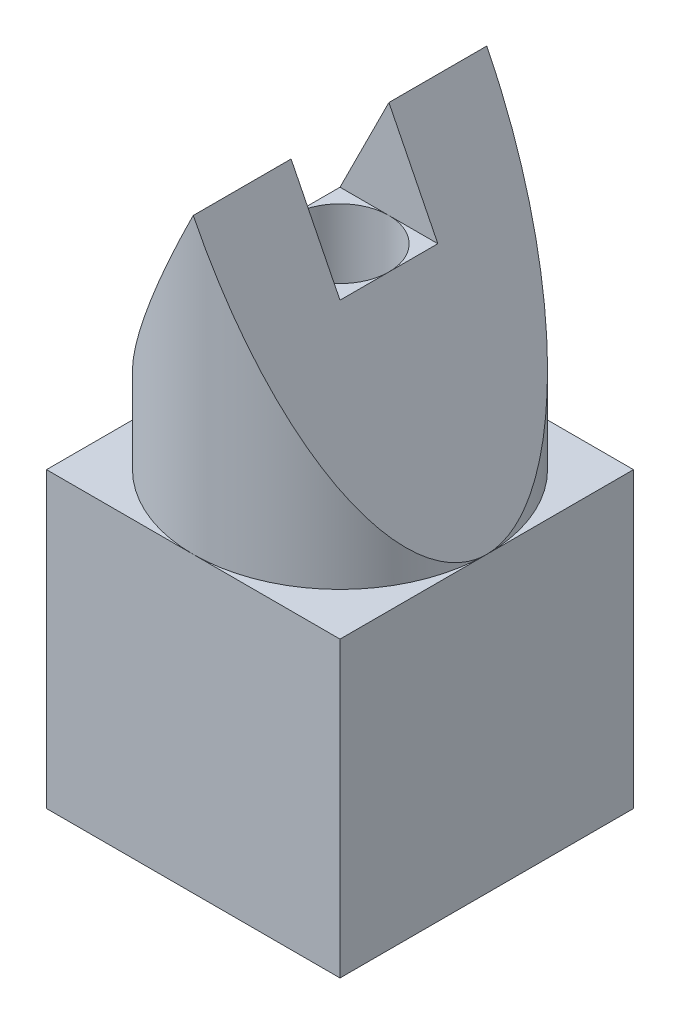
ISO-10303-21;
HEADER;
FILE_DESCRIPTION(('STEP AP214'),'2;1');
FILE_NAME('part.step','',(''),(''),'','','');
FILE_SCHEMA(('AUTOMOTIVE_DESIGN { 1 0 10303 214 1 1 1 1 }'));
ENDSEC;
DATA;
#1=APPLICATION_CONTEXT('core data for automotive mechanical design processes');
#2=APPLICATION_PROTOCOL_DEFINITION('international standard','automotive_design',2000,#1);
#3=PRODUCT_CONTEXT('',#1,'mechanical');
#4=PRODUCT('Part','Part','',(#3));
#5=PRODUCT_RELATED_PRODUCT_CATEGORY('part','',(#4));
#6=PRODUCT_DEFINITION_FORMATION('','',#4);
#7=PRODUCT_DEFINITION_CONTEXT('part definition',#1,'design');
#8=PRODUCT_DEFINITION('design','',#6,#7);
#9=PRODUCT_DEFINITION_SHAPE('','',#8);
#10=(LENGTH_UNIT() NAMED_UNIT(*) SI_UNIT(.MILLI.,.METRE.));
#11=(NAMED_UNIT(*) PLANE_ANGLE_UNIT() SI_UNIT($,.RADIAN.));
#12=(NAMED_UNIT(*) SI_UNIT($,.STERADIAN.) SOLID_ANGLE_UNIT());
#13=UNCERTAINTY_MEASURE_WITH_UNIT(LENGTH_MEASURE(1.E-05),#10,'distance_accuracy_value','');
#14=(GEOMETRIC_REPRESENTATION_CONTEXT(3) GLOBAL_UNCERTAINTY_ASSIGNED_CONTEXT((#13)) GLOBAL_UNIT_ASSIGNED_CONTEXT((#10,
#11,#12)) REPRESENTATION_CONTEXT('',''));
#15=CARTESIAN_POINT('',(0.,0.,0.));
#16=DIRECTION('',(0.,0.,1.));
#17=DIRECTION('',(1.,0.,0.));
#18=AXIS2_PLACEMENT_3D('',#15,#16,#17);
#19=CARTESIAN_POINT('',(0.,120.,0.));
#20=DIRECTION('',(0.,-1.,0.));
#21=DIRECTION('',(0.,0.,-1.));
#22=AXIS2_PLACEMENT_3D('',#19,#20,#21);
#23=CYLINDRICAL_SURFACE('',#22,30.);
#24=CARTESIAN_POINT('',(0.,120.,0.));
#25=DIRECTION('',(-0.894427190999916,0.447213595499958,0.));
#26=DIRECTION('',(-0.447213595499958,-0.894427190999916,0.));
#27=AXIS2_PLACEMENT_3D('',#24,#25,#26);
#28=ELLIPSE('',#27,67.0820393249937,30.);
#29=CARTESIAN_POINT('',(-30.,60.,0.));
#30=VERTEX_POINT('',#29);
#31=CARTESIAN_POINT('',(0.,120.,30.));
#32=VERTEX_POINT('',#31);
#33=EDGE_CURVE('E197',#30,#32,#28,.T.);
#34=ORIENTED_EDGE('',*,*,#33,.F.);
#35=CARTESIAN_POINT('',(0.,60.,0.));
#36=DIRECTION('',(0.,1.,0.));
#37=DIRECTION('',(0.,0.,1.));
#38=AXIS2_PLACEMENT_3D('',#35,#36,#37);
#39=CIRCLE('',#38,30.);
#40=CARTESIAN_POINT('',(0.,60.,30.));
#41=VERTEX_POINT('',#40);
#42=EDGE_CURVE('E165',#41,#30,#39,.F.);
#43=ORIENTED_EDGE('',*,*,#42,.F.);
#44=CARTESIAN_POINT('',(30.,60.,0.));
#45=VERTEX_POINT('',#44);
#46=EDGE_CURVE('E136',#45,#41,#39,.F.);
#47=ORIENTED_EDGE('',*,*,#46,.F.);
#48=CARTESIAN_POINT('',(0.,120.,0.));
#49=DIRECTION('',(0.894427190999916,0.447213595499958,0.));
#50=DIRECTION('',(0.447213595499958,-0.894427190999916,0.));
#51=AXIS2_PLACEMENT_3D('',#48,#49,#50);
#52=ELLIPSE('',#51,67.0820393249937,30.);
#53=EDGE_CURVE('E64',#32,#45,#52,.T.);
#54=ORIENTED_EDGE('',*,*,#53,.F.);
#55=EDGE_LOOP('',(#34,#43,#47,#54));
#56=FACE_BOUND('',#55,.T.);
#57=ADVANCED_FACE('F39',(#56),#23,.T.);
#58=CARTESIAN_POINT('',(0.,120.,-30.));
#59=VERTEX_POINT('',#58);
#60=EDGE_CURVE('E56',#59,#30,#28,.T.);
#61=ORIENTED_EDGE('',*,*,#60,.F.);
#62=EDGE_CURVE('E168',#45,#59,#52,.T.);
#63=ORIENTED_EDGE('',*,*,#62,.F.);
#64=CARTESIAN_POINT('',(0.,60.,-30.));
#65=VERTEX_POINT('',#64);
#66=EDGE_CURVE('E157',#65,#45,#39,.F.);
#67=ORIENTED_EDGE('',*,*,#66,.F.);
#68=EDGE_CURVE('E162',#30,#65,#39,.F.);
#69=ORIENTED_EDGE('',*,*,#68,.F.);
#70=EDGE_LOOP('',(#61,#63,#67,#69));
#71=FACE_BOUND('',#70,.T.);
#72=ADVANCED_FACE('F169',(#71),#23,.T.);
#73=CARTESIAN_POINT('',(0.,100.,10.));
#74=DIRECTION('',(0.,0.,-1.));
#75=DIRECTION('',(-1.,0.,0.));
#76=AXIS2_PLACEMENT_3D('',#73,#74,#75);
#77=PLANE('',#76);
#78=DIRECTION('',(-1.,0.,0.));
#79=VECTOR('',#78,1.);
#80=CARTESIAN_POINT('',(0.,100.,10.));
#81=LINE('',#80,#79);
#82=CARTESIAN_POINT('',(0.,100.,10.));
#83=VERTEX_POINT('',#82);
#84=CARTESIAN_POINT('',(-10.,100.,10.));
#85=VERTEX_POINT('',#84);
#86=EDGE_CURVE('E202',#83,#85,#81,.T.);
#87=ORIENTED_EDGE('',*,*,#86,.T.);
#88=DIRECTION('',(0.447213595499958,0.894427190999916,0.));
#89=VECTOR('',#88,1.);
#90=CARTESIAN_POINT('',(-8.,104.,10.));
#91=LINE('',#90,#89);
#92=CARTESIAN_POINT('',(0.,120.,10.));
#93=VERTEX_POINT('',#92);
#94=EDGE_CURVE('E192',#85,#93,#91,.T.);
#95=ORIENTED_EDGE('',*,*,#94,.T.);
#96=DIRECTION('',(0.447213595499958,-0.894427190999916,0.));
#97=VECTOR('',#96,1.);
#98=CARTESIAN_POINT('',(7.99999999999999,104.,10.));
#99=LINE('',#98,#97);
#100=CARTESIAN_POINT('',(9.99999999999999,100.,10.));
#101=VERTEX_POINT('',#100);
#102=EDGE_CURVE('E182',#93,#101,#99,.T.);
#103=ORIENTED_EDGE('',*,*,#102,.T.);
#104=EDGE_CURVE('E203',#101,#83,#81,.T.);
#105=ORIENTED_EDGE('',*,*,#104,.T.);
#106=EDGE_LOOP('',(#87,#95,#103,#105));
#107=FACE_BOUND('',#106,.T.);
#108=ADVANCED_FACE('F336',(#107),#77,.T.);
#109=CARTESIAN_POINT('',(0.,100.,-9.99999999999999));
#110=DIRECTION('',(0.,0.,-1.));
#111=DIRECTION('',(-1.,0.,0.));
#112=AXIS2_PLACEMENT_3D('',#109,#110,#111);
#113=PLANE('',#112);
#114=DIRECTION('',(0.447213595499958,0.894427190999916,0.));
#115=VECTOR('',#114,1.);
#116=CARTESIAN_POINT('',(-8.,104.,-9.99999999999999));
#117=LINE('',#116,#115);
#118=CARTESIAN_POINT('',(-10.,100.,-9.99999999999999));
#119=VERTEX_POINT('',#118);
#120=CARTESIAN_POINT('',(0.,120.,-9.99999999999999));
#121=VERTEX_POINT('',#120);
#122=EDGE_CURVE('E174',#119,#121,#117,.T.);
#123=ORIENTED_EDGE('',*,*,#122,.F.);
#124=DIRECTION('',(-1.,0.,0.));
#125=VECTOR('',#124,1.);
#126=CARTESIAN_POINT('',(0.,100.,-9.99999999999999));
#127=LINE('',#126,#125);
#128=CARTESIAN_POINT('',(0.,100.,-9.99999999999999));
#129=VERTEX_POINT('',#128);
#130=EDGE_CURVE('E212',#129,#119,#127,.T.);
#131=ORIENTED_EDGE('',*,*,#130,.F.);
#132=CARTESIAN_POINT('',(10.,100.,-9.99999999999999));
#133=VERTEX_POINT('',#132);
#134=EDGE_CURVE('E213',#133,#129,#127,.T.);
#135=ORIENTED_EDGE('',*,*,#134,.F.);
#136=DIRECTION('',(0.447213595499958,-0.894427190999916,0.));
#137=VECTOR('',#136,1.);
#138=CARTESIAN_POINT('',(7.99999999999999,104.,-9.99999999999999));
#139=LINE('',#138,#137);
#140=EDGE_CURVE('E185',#121,#133,#139,.T.);
#141=ORIENTED_EDGE('',*,*,#140,.F.);
#142=EDGE_LOOP('',(#123,#131,#135,#141));
#143=FACE_BOUND('',#142,.T.);
#144=ADVANCED_FACE('F274',(#143),#113,.F.);
#145=CARTESIAN_POINT('',(0.,100.,0.));
#146=DIRECTION('',(0.,1.,0.));
#147=DIRECTION('',(0.,0.,1.));
#148=AXIS2_PLACEMENT_3D('',#145,#146,#147);
#149=PLANE('',#148);
#150=ORIENTED_EDGE('',*,*,#86,.F.);
#151=CARTESIAN_POINT('',(0.,100.,0.));
#152=DIRECTION('',(0.,1.,0.));
#153=DIRECTION('',(0.,0.,1.));
#154=AXIS2_PLACEMENT_3D('',#151,#152,#153);
#155=CIRCLE('',#154,10.);
#156=CARTESIAN_POINT('',(-10.,100.,0.));
#157=VERTEX_POINT('',#156);
#158=EDGE_CURVE('E11',#83,#157,#155,.F.);
#159=ORIENTED_EDGE('',*,*,#158,.T.);
#160=DIRECTION('',(0.,0.,1.));
#161=VECTOR('',#160,1.);
#162=CARTESIAN_POINT('',(-10.,100.,0.));
#163=LINE('',#162,#161);
#164=EDGE_CURVE('E207',#157,#85,#163,.T.);
#165=ORIENTED_EDGE('',*,*,#164,.T.);
#166=EDGE_LOOP('',(#150,#159,#165));
#167=FACE_BOUND('',#166,.T.);
#168=ADVANCED_FACE('F328',(#167),#149,.T.);
#169=EDGE_CURVE('E208',#119,#157,#163,.T.);
#170=ORIENTED_EDGE('',*,*,#169,.T.);
#171=EDGE_CURVE('E49',#157,#129,#155,.F.);
#172=ORIENTED_EDGE('',*,*,#171,.T.);
#173=ORIENTED_EDGE('',*,*,#130,.T.);
#174=EDGE_LOOP('',(#170,#172,#173));
#175=FACE_BOUND('',#174,.T.);
#176=ADVANCED_FACE('F268',(#175),#149,.T.);
#177=ORIENTED_EDGE('',*,*,#134,.T.);
#178=CARTESIAN_POINT('',(10.,100.,0.));
#179=VERTEX_POINT('',#178);
#180=EDGE_CURVE('E256',#129,#179,#155,.F.);
#181=ORIENTED_EDGE('',*,*,#180,.T.);
#182=DIRECTION('',(0.,0.,1.));
#183=VECTOR('',#182,1.);
#184=CARTESIAN_POINT('',(10.,100.,0.));
#185=LINE('',#184,#183);
#186=EDGE_CURVE('E167',#133,#179,#185,.T.);
#187=ORIENTED_EDGE('',*,*,#186,.F.);
#188=EDGE_LOOP('',(#177,#181,#187));
#189=FACE_BOUND('',#188,.T.);
#190=ADVANCED_FACE('F277',(#189),#149,.T.);
#191=CARTESIAN_POINT('',(0.,60.,0.));
#192=DIRECTION('',(0.,1.,0.));
#193=DIRECTION('',(0.,0.,1.));
#194=AXIS2_PLACEMENT_3D('',#191,#192,#193);
#195=PLANE('',#194);
#196=DIRECTION('',(1.,0.,0.));
#197=VECTOR('',#196,1.);
#198=CARTESIAN_POINT('',(-30.,60.,30.));
#199=LINE('',#198,#197);
#200=CARTESIAN_POINT('',(-30.,60.,30.));
#201=VERTEX_POINT('',#200);
#202=EDGE_CURVE('E156',#201,#41,#199,.T.);
#203=ORIENTED_EDGE('',*,*,#202,.T.);
#204=ORIENTED_EDGE('',*,*,#42,.T.);
#205=DIRECTION('',(0.,0.,-1.));
#206=VECTOR('',#205,1.);
#207=CARTESIAN_POINT('',(-30.,60.,30.));
#208=LINE('',#207,#206);
#209=EDGE_CURVE('E228',#201,#30,#208,.T.);
#210=ORIENTED_EDGE('',*,*,#209,.F.);
#211=EDGE_LOOP('',(#203,#204,#210));
#212=FACE_BOUND('',#211,.T.);
#213=ADVANCED_FACE('F298',(#212),#195,.T.);
#214=CARTESIAN_POINT('',(-30.,60.,-30.));
#215=VERTEX_POINT('',#214);
#216=EDGE_CURVE('E227',#30,#215,#208,.T.);
#217=ORIENTED_EDGE('',*,*,#216,.F.);
#218=ORIENTED_EDGE('',*,*,#68,.T.);
#219=DIRECTION('',(1.,0.,0.));
#220=VECTOR('',#219,1.);
#221=CARTESIAN_POINT('',(-30.,60.,-30.));
#222=LINE('',#221,#220);
#223=EDGE_CURVE('E224',#215,#65,#222,.T.);
#224=ORIENTED_EDGE('',*,*,#223,.F.);
#225=EDGE_LOOP('',(#217,#218,#224));
#226=FACE_BOUND('',#225,.T.);
#227=ADVANCED_FACE('F301',(#226),#195,.T.);
#228=CARTESIAN_POINT('',(30.,60.,-30.));
#229=VERTEX_POINT('',#228);
#230=EDGE_CURVE('E143',#65,#229,#222,.T.);
#231=ORIENTED_EDGE('',*,*,#230,.F.);
#232=ORIENTED_EDGE('',*,*,#66,.T.);
#233=DIRECTION('',(0.,0.,-1.));
#234=VECTOR('',#233,1.);
#235=CARTESIAN_POINT('',(30.,60.,30.));
#236=LINE('',#235,#234);
#237=EDGE_CURVE('E144',#45,#229,#236,.T.);
#238=ORIENTED_EDGE('',*,*,#237,.T.);
#239=EDGE_LOOP('',(#231,#232,#238));
#240=FACE_BOUND('',#239,.T.);
#241=ADVANCED_FACE('F158',(#240),#195,.T.);
#242=CARTESIAN_POINT('',(-30.,60.,30.));
#243=DIRECTION('',(0.,0.,-1.));
#244=DIRECTION('',(-1.,0.,0.));
#245=AXIS2_PLACEMENT_3D('',#242,#243,#244);
#246=PLANE('',#245);
#247=DIRECTION('',(1.,0.,0.));
#248=VECTOR('',#247,1.);
#249=CARTESIAN_POINT('',(-30.,0.,30.));
#250=LINE('',#249,#248);
#251=CARTESIAN_POINT('',(-30.,0.,30.));
#252=VERTEX_POINT('',#251);
#253=CARTESIAN_POINT('',(30.,0.,30.));
#254=VERTEX_POINT('',#253);
#255=EDGE_CURVE('E233',#252,#254,#250,.T.);
#256=ORIENTED_EDGE('',*,*,#255,.T.);
#257=DIRECTION('',(0.,-1.,0.));
#258=VECTOR('',#257,1.);
#259=CARTESIAN_POINT('',(30.,60.,30.));
#260=LINE('',#259,#258);
#261=CARTESIAN_POINT('',(30.,60.,30.));
#262=VERTEX_POINT('',#261);
#263=EDGE_CURVE('E252',#262,#254,#260,.T.);
#264=ORIENTED_EDGE('',*,*,#263,.F.);
#265=EDGE_CURVE('E138',#41,#262,#199,.T.);
#266=ORIENTED_EDGE('',*,*,#265,.F.);
#267=ORIENTED_EDGE('',*,*,#202,.F.);
#268=DIRECTION('',(0.,-1.,0.));
#269=VECTOR('',#268,1.);
#270=CARTESIAN_POINT('',(-30.,60.,30.));
#271=LINE('',#270,#269);
#272=EDGE_CURVE('E232',#201,#252,#271,.T.);
#273=ORIENTED_EDGE('',*,*,#272,.T.);
#274=EDGE_LOOP('',(#256,#264,#266,#267,#273));
#275=FACE_BOUND('',#274,.T.);
#276=ADVANCED_FACE('F41',(#275),#246,.F.);
#277=CARTESIAN_POINT('',(30.,60.,30.));
#278=DIRECTION('',(-1.,0.,0.));
#279=DIRECTION('',(0.,0.,1.));
#280=AXIS2_PLACEMENT_3D('',#277,#278,#279);
#281=PLANE('',#280);
#282=DIRECTION('',(0.,0.,-1.));
#283=VECTOR('',#282,1.);
#284=CARTESIAN_POINT('',(30.,0.,30.));
#285=LINE('',#284,#283);
#286=CARTESIAN_POINT('',(30.,0.,-30.));
#287=VERTEX_POINT('',#286);
#288=EDGE_CURVE('E236',#254,#287,#285,.T.);
#289=ORIENTED_EDGE('',*,*,#288,.T.);
#290=DIRECTION('',(0.,-1.,0.));
#291=VECTOR('',#290,1.);
#292=CARTESIAN_POINT('',(30.,60.,-30.));
#293=LINE('',#292,#291);
#294=EDGE_CURVE('E152',#229,#287,#293,.T.);
#295=ORIENTED_EDGE('',*,*,#294,.F.);
#296=ORIENTED_EDGE('',*,*,#237,.F.);
#297=EDGE_CURVE('E133',#262,#45,#236,.T.);
#298=ORIENTED_EDGE('',*,*,#297,.F.);
#299=ORIENTED_EDGE('',*,*,#263,.T.);
#300=EDGE_LOOP('',(#289,#295,#296,#298,#299));
#301=FACE_BOUND('',#300,.T.);
#302=ADVANCED_FACE('F150',(#301),#281,.F.);
#303=CARTESIAN_POINT('',(-30.,60.,-30.));
#304=DIRECTION('',(0.,0.,-1.));
#305=DIRECTION('',(-1.,0.,0.));
#306=AXIS2_PLACEMENT_3D('',#303,#304,#305);
#307=PLANE('',#306);
#308=ORIENTED_EDGE('',*,*,#223,.T.);
#309=ORIENTED_EDGE('',*,*,#230,.T.);
#310=ORIENTED_EDGE('',*,*,#294,.T.);
#311=DIRECTION('',(1.,0.,0.));
#312=VECTOR('',#311,1.);
#313=CARTESIAN_POINT('',(-30.,0.,-30.));
#314=LINE('',#313,#312);
#315=CARTESIAN_POINT('',(-30.,0.,-30.));
#316=VERTEX_POINT('',#315);
#317=EDGE_CURVE('E239',#316,#287,#314,.T.);
#318=ORIENTED_EDGE('',*,*,#317,.F.);
#319=DIRECTION('',(0.,-1.,0.));
#320=VECTOR('',#319,1.);
#321=CARTESIAN_POINT('',(-30.,60.,-30.));
#322=LINE('',#321,#320);
#323=EDGE_CURVE('E247',#215,#316,#322,.T.);
#324=ORIENTED_EDGE('',*,*,#323,.F.);
#325=EDGE_LOOP('',(#308,#309,#310,#318,#324));
#326=FACE_BOUND('',#325,.T.);
#327=ADVANCED_FACE('F313',(#326),#307,.T.);
#328=CARTESIAN_POINT('',(-30.,60.,30.));
#329=DIRECTION('',(-1.,0.,0.));
#330=DIRECTION('',(0.,0.,1.));
#331=AXIS2_PLACEMENT_3D('',#328,#329,#330);
#332=PLANE('',#331);
#333=ORIENTED_EDGE('',*,*,#209,.T.);
#334=ORIENTED_EDGE('',*,*,#216,.T.);
#335=ORIENTED_EDGE('',*,*,#323,.T.);
#336=DIRECTION('',(0.,0.,-1.));
#337=VECTOR('',#336,1.);
#338=CARTESIAN_POINT('',(-30.,0.,30.));
#339=LINE('',#338,#337);
#340=EDGE_CURVE('E242',#252,#316,#339,.T.);
#341=ORIENTED_EDGE('',*,*,#340,.F.);
#342=ORIENTED_EDGE('',*,*,#272,.F.);
#343=EDGE_LOOP('',(#333,#334,#335,#341,#342));
#344=FACE_BOUND('',#343,.T.);
#345=ADVANCED_FACE('F305',(#344),#332,.T.);
#346=ORIENTED_EDGE('',*,*,#297,.T.);
#347=ORIENTED_EDGE('',*,*,#46,.T.);
#348=ORIENTED_EDGE('',*,*,#265,.T.);
#349=EDGE_LOOP('',(#346,#347,#348));
#350=FACE_BOUND('',#349,.T.);
#351=ADVANCED_FACE('F135',(#350),#195,.T.);
#352=CARTESIAN_POINT('',(0.,0.,0.));
#353=DIRECTION('',(0.,1.,0.));
#354=DIRECTION('',(0.,0.,1.));
#355=AXIS2_PLACEMENT_3D('',#352,#353,#354);
#356=PLANE('',#355);
#357=CARTESIAN_POINT('',(0.,0.,0.));
#358=DIRECTION('',(0.,1.,0.));
#359=DIRECTION('',(0.,0.,1.));
#360=AXIS2_PLACEMENT_3D('',#357,#358,#359);
#361=CIRCLE('',#360,10.);
#362=CARTESIAN_POINT('',(0.,0.,10.));
#363=VERTEX_POINT('',#362);
#364=EDGE_CURVE('E198',#363,#363,#361,.T.);
#365=ORIENTED_EDGE('',*,*,#364,.T.);
#366=EDGE_LOOP('',(#365));
#367=FACE_BOUND('',#366,.T.);
#368=ORIENTED_EDGE('',*,*,#288,.F.);
#369=ORIENTED_EDGE('',*,*,#255,.F.);
#370=ORIENTED_EDGE('',*,*,#340,.T.);
#371=ORIENTED_EDGE('',*,*,#317,.T.);
#372=EDGE_LOOP('',(#368,#369,#370,#371));
#373=FACE_BOUND('',#372,.T.);
#374=ADVANCED_FACE('F317',(#367,#373),#356,.F.);
#375=EDGE_CURVE('E217',#179,#101,#185,.T.);
#376=ORIENTED_EDGE('',*,*,#375,.F.);
#377=EDGE_CURVE('E43',#179,#83,#155,.F.);
#378=ORIENTED_EDGE('',*,*,#377,.T.);
#379=ORIENTED_EDGE('',*,*,#104,.F.);
#380=EDGE_LOOP('',(#376,#378,#379));
#381=FACE_BOUND('',#380,.T.);
#382=ADVANCED_FACE('F319',(#381),#149,.T.);
#383=CARTESIAN_POINT('',(0.,120.,0.));
#384=DIRECTION('',(0.,-1.,0.));
#385=DIRECTION('',(0.,0.,-1.));
#386=AXIS2_PLACEMENT_3D('',#383,#384,#385);
#387=CYLINDRICAL_SURFACE('',#386,10.);
#388=ORIENTED_EDGE('',*,*,#377,.F.);
#389=ORIENTED_EDGE('',*,*,#180,.F.);
#390=ORIENTED_EDGE('',*,*,#171,.F.);
#391=ORIENTED_EDGE('',*,*,#158,.F.);
#392=EDGE_LOOP('',(#388,#389,#390,#391));
#393=FACE_BOUND('',#392,.T.);
#394=ORIENTED_EDGE('',*,*,#364,.F.);
#395=EDGE_LOOP('',(#394));
#396=FACE_BOUND('',#395,.T.);
#397=ADVANCED_FACE('F326',(#393,#396),#387,.F.);
#398=CARTESIAN_POINT('',(-30.,60.,238.711730708738));
#399=DIRECTION('',(-0.894427190999916,0.447213595499958,0.));
#400=DIRECTION('',(-0.447213595499958,-0.894427190999916,0.));
#401=AXIS2_PLACEMENT_3D('',#398,#399,#400);
#402=PLANE('',#401);
#403=ORIENTED_EDGE('',*,*,#60,.T.);
#404=ORIENTED_EDGE('',*,*,#33,.T.);
#405=DIRECTION('',(0.,0.,-1.));
#406=VECTOR('',#405,1.);
#407=CARTESIAN_POINT('',(0.,120.,238.711730708738));
#408=LINE('',#407,#406);
#409=EDGE_CURVE('E180',#32,#93,#408,.T.);
#410=ORIENTED_EDGE('',*,*,#409,.T.);
#411=ORIENTED_EDGE('',*,*,#94,.F.);
#412=ORIENTED_EDGE('',*,*,#164,.F.);
#413=ORIENTED_EDGE('',*,*,#169,.F.);
#414=ORIENTED_EDGE('',*,*,#122,.T.);
#415=EDGE_CURVE('E279',#121,#59,#408,.T.);
#416=ORIENTED_EDGE('',*,*,#415,.T.);
#417=EDGE_LOOP('',(#403,#404,#410,#411,#412,#413,#414,#416));
#418=FACE_BOUND('',#417,.T.);
#419=ADVANCED_FACE('F285',(#418),#402,.T.);
#420=CARTESIAN_POINT('',(0.,120.,238.711730708738));
#421=DIRECTION('',(0.894427190999916,0.447213595499958,0.));
#422=DIRECTION('',(-0.447213595499958,0.894427190999916,0.));
#423=AXIS2_PLACEMENT_3D('',#420,#421,#422);
#424=PLANE('',#423);
#425=ORIENTED_EDGE('',*,*,#53,.T.);
#426=ORIENTED_EDGE('',*,*,#62,.T.);
#427=ORIENTED_EDGE('',*,*,#415,.F.);
#428=ORIENTED_EDGE('',*,*,#140,.T.);
#429=ORIENTED_EDGE('',*,*,#186,.T.);
#430=ORIENTED_EDGE('',*,*,#375,.T.);
#431=ORIENTED_EDGE('',*,*,#102,.F.);
#432=ORIENTED_EDGE('',*,*,#409,.F.);
#433=EDGE_LOOP('',(#425,#426,#427,#428,#429,#430,#431,#432));
#434=FACE_BOUND('',#433,.T.);
#435=ADVANCED_FACE('F177',(#434),#424,.T.);
#436=CLOSED_SHELL('',(#57,#72,#108,#144,#168,#176,#190,#213,#227,#241,#276,#302,#327,#345,#351,
#374,#382,#397,#419,#435));
#437=MANIFOLD_SOLID_BREP('B2',#436);
#438=ADVANCED_BREP_SHAPE_REPRESENTATION('',(#18,#437),#14);
#439=SHAPE_DEFINITION_REPRESENTATION(#9,#438);
ENDSEC;
END-ISO-10303-21;
